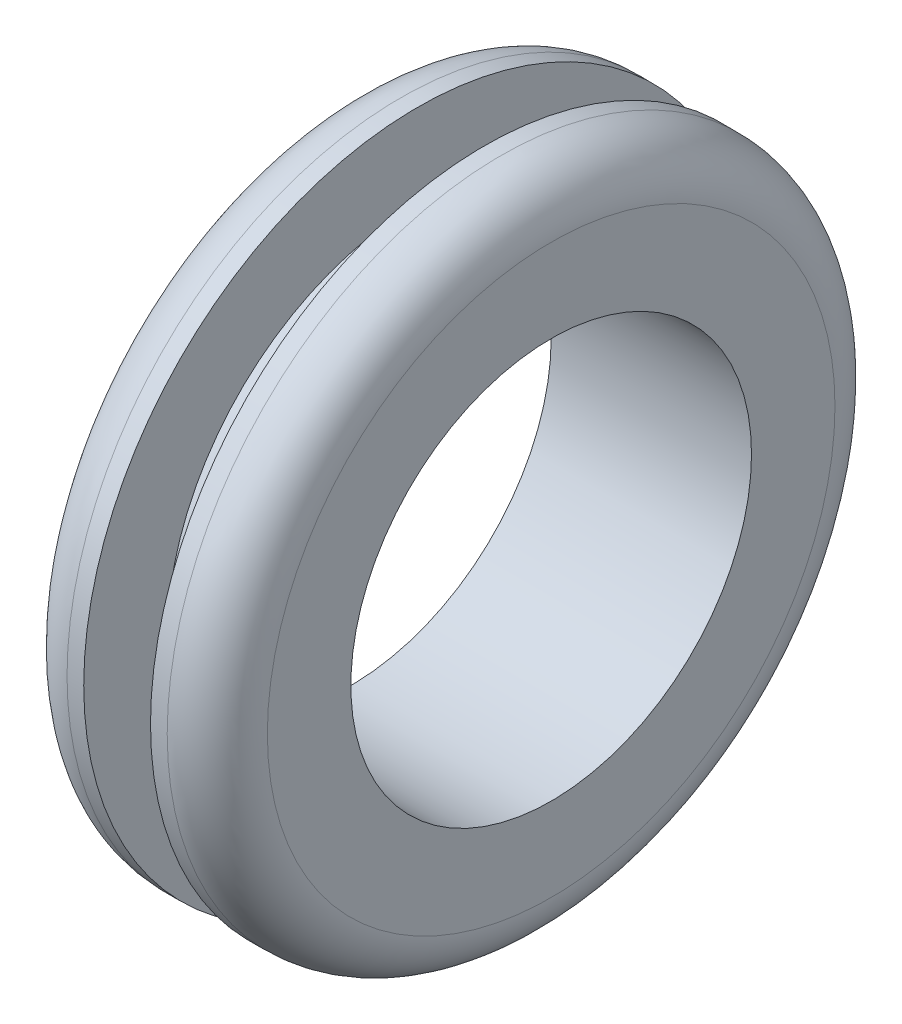
ISO-10303-21;
HEADER;
FILE_DESCRIPTION(('STEP AP214'),'2;1');
FILE_NAME('part.step','',(''),(''),'','','');
FILE_SCHEMA(('AUTOMOTIVE_DESIGN { 1 0 10303 214 1 1 1 1 }'));
ENDSEC;
DATA;
#1=APPLICATION_CONTEXT('core data for automotive mechanical design processes');
#2=APPLICATION_PROTOCOL_DEFINITION('international standard','automotive_design',2000,#1);
#3=PRODUCT_CONTEXT('',#1,'mechanical');
#4=PRODUCT('Part','Part','',(#3));
#5=PRODUCT_RELATED_PRODUCT_CATEGORY('part','',(#4));
#6=PRODUCT_DEFINITION_FORMATION('','',#4);
#7=PRODUCT_DEFINITION_CONTEXT('part definition',#1,'design');
#8=PRODUCT_DEFINITION('design','',#6,#7);
#9=PRODUCT_DEFINITION_SHAPE('','',#8);
#10=(LENGTH_UNIT() NAMED_UNIT(*) SI_UNIT(.MILLI.,.METRE.));
#11=(NAMED_UNIT(*) PLANE_ANGLE_UNIT() SI_UNIT($,.RADIAN.));
#12=(NAMED_UNIT(*) SI_UNIT($,.STERADIAN.) SOLID_ANGLE_UNIT());
#13=UNCERTAINTY_MEASURE_WITH_UNIT(LENGTH_MEASURE(1.E-05),#10,'distance_accuracy_value','');
#14=(GEOMETRIC_REPRESENTATION_CONTEXT(3) GLOBAL_UNCERTAINTY_ASSIGNED_CONTEXT((#13)) GLOBAL_UNIT_ASSIGNED_CONTEXT((#10,
#11,#12)) REPRESENTATION_CONTEXT('',''));
#15=CARTESIAN_POINT('',(0.,0.,0.));
#16=DIRECTION('',(0.,0.,1.));
#17=DIRECTION('',(1.,0.,0.));
#18=AXIS2_PLACEMENT_3D('',#15,#16,#17);
#19=CARTESIAN_POINT('',(-17.9673978065803,0.,0.));
#20=DIRECTION('',(1.,0.,0.));
#21=DIRECTION('',(0.,0.,-1.));
#22=AXIS2_PLACEMENT_3D('',#19,#20,#21);
#23=PLANE('',#22);
#24=CARTESIAN_POINT('',(-17.9673978065803,0.,0.));
#25=DIRECTION('',(1.,0.,0.));
#26=DIRECTION('',(0.,0.,-1.));
#27=AXIS2_PLACEMENT_3D('',#24,#25,#26);
#28=CIRCLE('',#27,8.5);
#29=CARTESIAN_POINT('',(-17.9673978065803,0.,-8.49999999999999));
#30=VERTEX_POINT('',#29);
#31=EDGE_CURVE('E40',#30,#30,#28,.F.);
#32=ORIENTED_EDGE('',*,*,#31,.T.);
#33=EDGE_LOOP('',(#32));
#34=FACE_BOUND('',#33,.T.);
#35=CARTESIAN_POINT('',(-17.9673978065803,0.,0.));
#36=DIRECTION('',(1.,0.,0.));
#37=DIRECTION('',(0.,0.,-1.));
#38=AXIS2_PLACEMENT_3D('',#35,#36,#37);
#39=CIRCLE('',#38,6.);
#40=CARTESIAN_POINT('',(-17.9673978065803,0.,-5.99999999999999));
#41=VERTEX_POINT('',#40);
#42=EDGE_CURVE('E57',#41,#41,#39,.T.);
#43=ORIENTED_EDGE('',*,*,#42,.T.);
#44=EDGE_LOOP('',(#43));
#45=FACE_BOUND('',#44,.T.);
#46=ADVANCED_FACE('F26',(#34,#45),#23,.F.);
#47=CARTESIAN_POINT('',(-29.1099700897308,0.,0.));
#48=DIRECTION('',(-1.,0.,0.));
#49=DIRECTION('',(0.,0.,1.));
#50=AXIS2_PLACEMENT_3D('',#47,#48,#49);
#51=CYLINDRICAL_SURFACE('',#50,10.);
#52=CARTESIAN_POINT('',(-16.4673978065803,0.,0.));
#53=DIRECTION('',(1.,0.,0.));
#54=DIRECTION('',(0.,0.,-1.));
#55=AXIS2_PLACEMENT_3D('',#52,#53,#54);
#56=CIRCLE('',#55,10.);
#57=CARTESIAN_POINT('',(-16.4673978065803,0.,-9.99999999999999));
#58=VERTEX_POINT('',#57);
#59=EDGE_CURVE('E36',#58,#58,#56,.T.);
#60=ORIENTED_EDGE('',*,*,#59,.T.);
#61=EDGE_LOOP('',(#60));
#62=FACE_BOUND('',#61,.T.);
#63=CARTESIAN_POINT('',(-15.9673978065803,0.,0.));
#64=DIRECTION('',(-1.,0.,0.));
#65=DIRECTION('',(0.,0.,1.));
#66=AXIS2_PLACEMENT_3D('',#63,#64,#65);
#67=CIRCLE('',#66,10.);
#68=CARTESIAN_POINT('',(-15.9673978065803,0.,10.));
#69=VERTEX_POINT('',#68);
#70=EDGE_CURVE('E45',#69,#69,#67,.T.);
#71=ORIENTED_EDGE('',*,*,#70,.T.);
#72=EDGE_LOOP('',(#71));
#73=FACE_BOUND('',#72,.T.);
#74=ADVANCED_FACE('F80',(#62,#73),#51,.T.);
#75=CARTESIAN_POINT('',(-15.9673978065803,10.,0.));
#76=DIRECTION('',(-1.,0.,0.));
#77=DIRECTION('',(0.,0.,1.));
#78=AXIS2_PLACEMENT_3D('',#75,#76,#77);
#79=PLANE('',#78);
#80=ORIENTED_EDGE('',*,*,#70,.F.);
#81=EDGE_LOOP('',(#80));
#82=FACE_BOUND('',#81,.T.);
#83=CARTESIAN_POINT('',(-15.9673978065803,0.,0.));
#84=DIRECTION('',(-1.,0.,0.));
#85=DIRECTION('',(0.,0.,1.));
#86=AXIS2_PLACEMENT_3D('',#83,#84,#85);
#87=CIRCLE('',#86,7.5);
#88=CARTESIAN_POINT('',(-15.9673978065803,0.,7.50000000000001));
#89=VERTEX_POINT('',#88);
#90=EDGE_CURVE('E48',#89,#89,#87,.T.);
#91=ORIENTED_EDGE('',*,*,#90,.T.);
#92=EDGE_LOOP('',(#91));
#93=FACE_BOUND('',#92,.T.);
#94=ADVANCED_FACE('F85',(#82,#93),#79,.F.);
#95=CARTESIAN_POINT('',(-29.1099700897308,0.,0.));
#96=DIRECTION('',(-1.,0.,0.));
#97=DIRECTION('',(0.,0.,1.));
#98=AXIS2_PLACEMENT_3D('',#95,#96,#97);
#99=CYLINDRICAL_SURFACE('',#98,7.5);
#100=ORIENTED_EDGE('',*,*,#90,.F.);
#101=EDGE_LOOP('',(#100));
#102=FACE_BOUND('',#101,.T.);
#103=CARTESIAN_POINT('',(-13.9673978065803,0.,0.));
#104=DIRECTION('',(-1.,0.,0.));
#105=DIRECTION('',(0.,0.,1.));
#106=AXIS2_PLACEMENT_3D('',#103,#104,#105);
#107=CIRCLE('',#106,7.5);
#108=CARTESIAN_POINT('',(-13.9673978065803,0.,7.50000000000001));
#109=VERTEX_POINT('',#108);
#110=EDGE_CURVE('E51',#109,#109,#107,.T.);
#111=ORIENTED_EDGE('',*,*,#110,.T.);
#112=EDGE_LOOP('',(#111));
#113=FACE_BOUND('',#112,.T.);
#114=ADVANCED_FACE('F106',(#102,#113),#99,.T.);
#115=CARTESIAN_POINT('',(-13.9673978065803,10.,0.));
#116=DIRECTION('',(1.,0.,0.));
#117=DIRECTION('',(0.,0.,-1.));
#118=AXIS2_PLACEMENT_3D('',#115,#116,#117);
#119=PLANE('',#118);
#120=ORIENTED_EDGE('',*,*,#110,.F.);
#121=EDGE_LOOP('',(#120));
#122=FACE_BOUND('',#121,.T.);
#123=CARTESIAN_POINT('',(-13.9673978065803,0.,0.));
#124=DIRECTION('',(-1.,0.,0.));
#125=DIRECTION('',(0.,0.,1.));
#126=AXIS2_PLACEMENT_3D('',#123,#124,#125);
#127=CIRCLE('',#126,10.);
#128=CARTESIAN_POINT('',(-13.9673978065803,0.,10.));
#129=VERTEX_POINT('',#128);
#130=EDGE_CURVE('E54',#129,#129,#127,.T.);
#131=ORIENTED_EDGE('',*,*,#130,.T.);
#132=EDGE_LOOP('',(#131));
#133=FACE_BOUND('',#132,.T.);
#134=ADVANCED_FACE('F77',(#122,#133),#119,.F.);
#135=CARTESIAN_POINT('',(-29.1099700897308,0.,0.));
#136=DIRECTION('',(-1.,0.,0.));
#137=DIRECTION('',(0.,0.,1.));
#138=AXIS2_PLACEMENT_3D('',#135,#136,#137);
#139=CYLINDRICAL_SURFACE('',#138,10.);
#140=CARTESIAN_POINT('',(-13.4673978065803,0.,0.));
#141=DIRECTION('',(-1.,0.,0.));
#142=DIRECTION('',(0.,0.,1.));
#143=AXIS2_PLACEMENT_3D('',#140,#141,#142);
#144=CIRCLE('',#143,10.);
#145=CARTESIAN_POINT('',(-13.4673978065803,0.,10.));
#146=VERTEX_POINT('',#145);
#147=EDGE_CURVE('E32',#146,#146,#144,.T.);
#148=ORIENTED_EDGE('',*,*,#147,.T.);
#149=EDGE_LOOP('',(#148));
#150=FACE_BOUND('',#149,.T.);
#151=ORIENTED_EDGE('',*,*,#130,.F.);
#152=EDGE_LOOP('',(#151));
#153=FACE_BOUND('',#152,.T.);
#154=ADVANCED_FACE('F68',(#150,#153),#139,.T.);
#155=CARTESIAN_POINT('',(-11.9673978065803,0.,0.));
#156=DIRECTION('',(-1.,0.,0.));
#157=DIRECTION('',(0.,0.,1.));
#158=AXIS2_PLACEMENT_3D('',#155,#156,#157);
#159=PLANE('',#158);
#160=CARTESIAN_POINT('',(-11.9673978065803,0.,0.));
#161=DIRECTION('',(-1.,0.,0.));
#162=DIRECTION('',(0.,0.,1.));
#163=AXIS2_PLACEMENT_3D('',#160,#161,#162);
#164=CIRCLE('',#163,8.5);
#165=CARTESIAN_POINT('',(-11.9673978065803,0.,8.50000000000001));
#166=VERTEX_POINT('',#165);
#167=EDGE_CURVE('E10',#166,#166,#164,.F.);
#168=ORIENTED_EDGE('',*,*,#167,.T.);
#169=EDGE_LOOP('',(#168));
#170=FACE_BOUND('',#169,.T.);
#171=CARTESIAN_POINT('',(-11.9673978065803,0.,0.));
#172=DIRECTION('',(1.,0.,0.));
#173=DIRECTION('',(0.,0.,-1.));
#174=AXIS2_PLACEMENT_3D('',#171,#172,#173);
#175=CIRCLE('',#174,6.);
#176=CARTESIAN_POINT('',(-11.9673978065803,0.,-5.99999999999999));
#177=VERTEX_POINT('',#176);
#178=EDGE_CURVE('E60',#177,#177,#175,.T.);
#179=ORIENTED_EDGE('',*,*,#178,.F.);
#180=EDGE_LOOP('',(#179));
#181=FACE_BOUND('',#180,.T.);
#182=ADVANCED_FACE('F66',(#170,#181),#159,.F.);
#183=CARTESIAN_POINT('',(-17.9673978065803,0.,0.));
#184=DIRECTION('',(1.,0.,0.));
#185=DIRECTION('',(0.,0.,-1.));
#186=AXIS2_PLACEMENT_3D('',#183,#184,#185);
#187=CYLINDRICAL_SURFACE('',#186,6.);
#188=ORIENTED_EDGE('',*,*,#42,.F.);
#189=EDGE_LOOP('',(#188));
#190=FACE_BOUND('',#189,.T.);
#191=ORIENTED_EDGE('',*,*,#178,.T.);
#192=EDGE_LOOP('',(#191));
#193=FACE_BOUND('',#192,.T.);
#194=ADVANCED_FACE('F64',(#190,#193),#187,.F.);
#195=CARTESIAN_POINT('',(-16.4673978065803,0.,0.));
#196=DIRECTION('',(1.,0.,0.));
#197=DIRECTION('',(0.,0.,-1.));
#198=AXIS2_PLACEMENT_3D('',#195,#196,#197);
#199=TOROIDAL_SURFACE('',#198,8.5,1.5);
#200=ORIENTED_EDGE('',*,*,#59,.F.);
#201=EDGE_LOOP('',(#200));
#202=FACE_BOUND('',#201,.T.);
#203=ORIENTED_EDGE('',*,*,#31,.F.);
#204=EDGE_LOOP('',(#203));
#205=FACE_BOUND('',#204,.T.);
#206=ADVANCED_FACE('F74',(#202,#205),#199,.T.);
#207=CARTESIAN_POINT('',(-13.4673978065803,0.,0.));
#208=DIRECTION('',(-1.,0.,0.));
#209=DIRECTION('',(0.,0.,1.));
#210=AXIS2_PLACEMENT_3D('',#207,#208,#209);
#211=TOROIDAL_SURFACE('',#210,8.5,1.5);
#212=ORIENTED_EDGE('',*,*,#167,.F.);
#213=EDGE_LOOP('',(#212));
#214=FACE_BOUND('',#213,.T.);
#215=ORIENTED_EDGE('',*,*,#147,.F.);
#216=EDGE_LOOP('',(#215));
#217=FACE_BOUND('',#216,.T.);
#218=ADVANCED_FACE('F92',(#214,#217),#211,.T.);
#219=CLOSED_SHELL('',(#46,#74,#94,#114,#134,#154,#182,#194,#206,#218));
#220=MANIFOLD_SOLID_BREP('B2',#219);
#221=ADVANCED_BREP_SHAPE_REPRESENTATION('',(#18,#220),#14);
#222=SHAPE_DEFINITION_REPRESENTATION(#9,#221);
ENDSEC;
END-ISO-10303-21;
